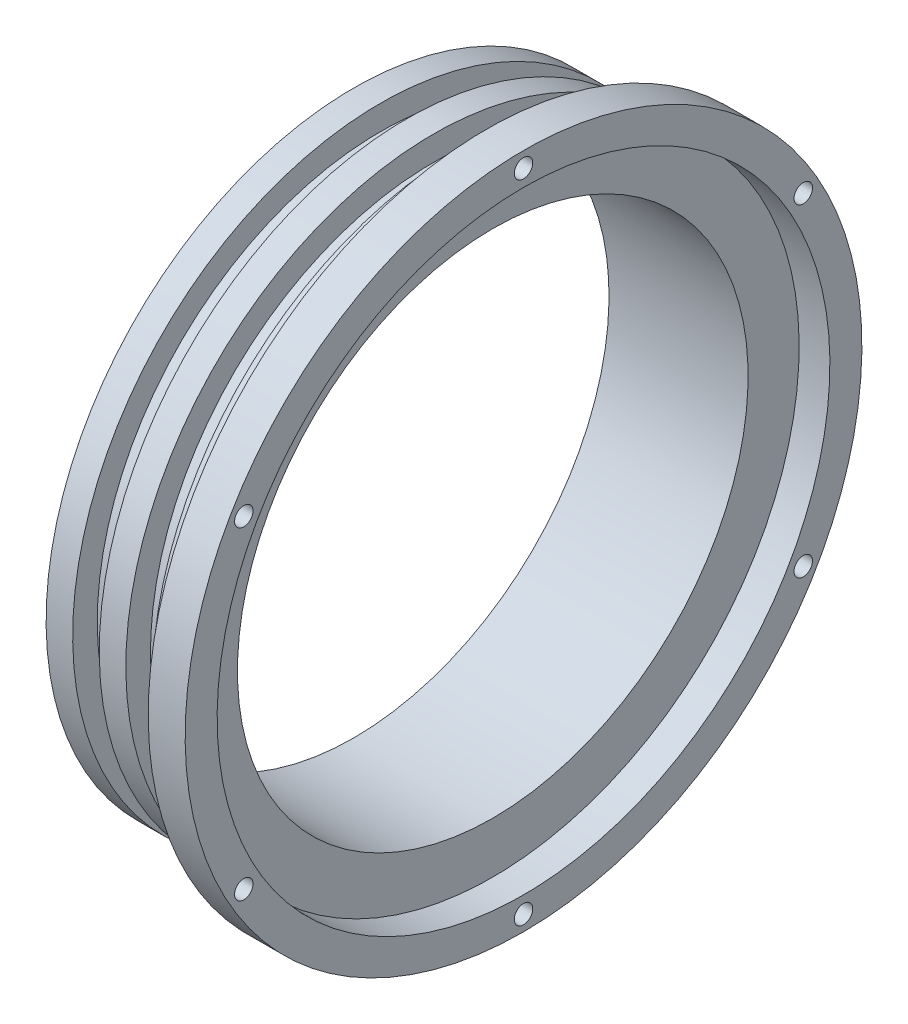
ISO-10303-21;
HEADER;
FILE_DESCRIPTION(('STEP AP214'),'2;1');
FILE_NAME('part.step','',(''),(''),'','','');
FILE_SCHEMA(('AUTOMOTIVE_DESIGN { 1 0 10303 214 1 1 1 1 }'));
ENDSEC;
DATA;
#1=APPLICATION_CONTEXT('core data for automotive mechanical design processes');
#2=APPLICATION_PROTOCOL_DEFINITION('international standard','automotive_design',2000,#1);
#3=PRODUCT_CONTEXT('',#1,'mechanical');
#4=PRODUCT('Part','Part','',(#3));
#5=PRODUCT_RELATED_PRODUCT_CATEGORY('part','',(#4));
#6=PRODUCT_DEFINITION_FORMATION('','',#4);
#7=PRODUCT_DEFINITION_CONTEXT('part definition',#1,'design');
#8=PRODUCT_DEFINITION('design','',#6,#7);
#9=PRODUCT_DEFINITION_SHAPE('','',#8);
#10=(LENGTH_UNIT() NAMED_UNIT(*) SI_UNIT(.MILLI.,.METRE.));
#11=(NAMED_UNIT(*) PLANE_ANGLE_UNIT() SI_UNIT($,.RADIAN.));
#12=(NAMED_UNIT(*) SI_UNIT($,.STERADIAN.) SOLID_ANGLE_UNIT());
#13=UNCERTAINTY_MEASURE_WITH_UNIT(LENGTH_MEASURE(1.E-05),#10,'distance_accuracy_value','');
#14=(GEOMETRIC_REPRESENTATION_CONTEXT(3) GLOBAL_UNCERTAINTY_ASSIGNED_CONTEXT((#13)) GLOBAL_UNIT_ASSIGNED_CONTEXT((#10,
#11,#12)) REPRESENTATION_CONTEXT('',''));
#15=CARTESIAN_POINT('',(0.,0.,0.));
#16=DIRECTION('',(0.,0.,1.));
#17=DIRECTION('',(1.,0.,0.));
#18=AXIS2_PLACEMENT_3D('',#15,#16,#17);
#19=CARTESIAN_POINT('',(27.6,0.,0.));
#20=DIRECTION('',(-1.,0.,0.));
#21=DIRECTION('',(0.,-1.,0.));
#22=AXIS2_PLACEMENT_3D('',#19,#20,#21);
#23=CYLINDRICAL_SURFACE('',#22,41.5);
#24=CARTESIAN_POINT('',(0.,0.,0.));
#25=DIRECTION('',(-1.,0.,0.));
#26=DIRECTION('',(0.,-1.,0.));
#27=AXIS2_PLACEMENT_3D('',#24,#25,#26);
#28=CIRCLE('',#27,41.5);
#29=CARTESIAN_POINT('',(0.,-41.5,0.));
#30=VERTEX_POINT('',#29);
#31=EDGE_CURVE('E10',#30,#30,#28,.T.);
#32=ORIENTED_EDGE('',*,*,#31,.T.);
#33=EDGE_LOOP('',(#32));
#34=FACE_BOUND('',#33,.T.);
#35=CARTESIAN_POINT('',(22.6,0.,0.));
#36=DIRECTION('',(1.,0.,0.));
#37=DIRECTION('',(0.,1.,0.));
#38=AXIS2_PLACEMENT_3D('',#35,#36,#37);
#39=CIRCLE('',#38,41.5);
#40=CARTESIAN_POINT('',(22.6,41.5,0.));
#41=VERTEX_POINT('',#40);
#42=EDGE_CURVE('E36',#41,#41,#39,.F.);
#43=ORIENTED_EDGE('',*,*,#42,.F.);
#44=EDGE_LOOP('',(#43));
#45=FACE_BOUND('',#44,.T.);
#46=ADVANCED_FACE('F33',(#34,#45),#23,.F.);
#47=CARTESIAN_POINT('',(0.,41.5,0.));
#48=DIRECTION('',(1.,0.,0.));
#49=DIRECTION('',(0.,1.,0.));
#50=AXIS2_PLACEMENT_3D('',#47,#48,#49);
#51=PLANE('',#50);
#52=CARTESIAN_POINT('',(0.,22.0000000000004,-38.105117766515));
#53=DIRECTION('',(-1.,0.,0.));
#54=DIRECTION('',(0.,-0.50000000000001,0.866025403784433));
#55=AXIS2_PLACEMENT_3D('',#52,#53,#54);
#56=CIRCLE('',#55,1.5);
#57=CARTESIAN_POINT('',(0.,21.2500000000004,-36.8060796608384));
#58=VERTEX_POINT('',#57);
#59=EDGE_CURVE('E92',#58,#58,#56,.T.);
#60=ORIENTED_EDGE('',*,*,#59,.F.);
#61=EDGE_LOOP('',(#60));
#62=FACE_BOUND('',#61,.T.);
#63=CARTESIAN_POINT('',(0.,-21.9999999999996,-38.1051177665155));
#64=DIRECTION('',(-1.,0.,0.));
#65=DIRECTION('',(0.,0.499999999999992,0.866025403784443));
#66=AXIS2_PLACEMENT_3D('',#63,#64,#65);
#67=CIRCLE('',#66,1.5);
#68=CARTESIAN_POINT('',(0.,-21.2499999999997,-36.8060796608388));
#69=VERTEX_POINT('',#68);
#70=EDGE_CURVE('E99',#69,#69,#67,.T.);
#71=ORIENTED_EDGE('',*,*,#70,.F.);
#72=EDGE_LOOP('',(#71));
#73=FACE_BOUND('',#72,.T.);
#74=CARTESIAN_POINT('',(0.,-44.,0.));
#75=DIRECTION('',(-1.,0.,0.));
#76=DIRECTION('',(0.,1.,0.));
#77=AXIS2_PLACEMENT_3D('',#74,#75,#76);
#78=CIRCLE('',#77,1.5);
#79=CARTESIAN_POINT('',(0.,-42.5,0.));
#80=VERTEX_POINT('',#79);
#81=EDGE_CURVE('E105',#80,#80,#78,.T.);
#82=ORIENTED_EDGE('',*,*,#81,.F.);
#83=EDGE_LOOP('',(#82));
#84=FACE_BOUND('',#83,.T.);
#85=CARTESIAN_POINT('',(0.,-22.0000000000002,38.1051177665152));
#86=DIRECTION('',(-1.,0.,0.));
#87=DIRECTION('',(0.,0.500000000000004,-0.866025403784436));
#88=AXIS2_PLACEMENT_3D('',#85,#86,#87);
#89=CIRCLE('',#88,1.5);
#90=CARTESIAN_POINT('',(0.,-21.2500000000002,36.8060796608385));
#91=VERTEX_POINT('',#90);
#92=EDGE_CURVE('E111',#91,#91,#89,.T.);
#93=ORIENTED_EDGE('',*,*,#92,.F.);
#94=EDGE_LOOP('',(#93));
#95=FACE_BOUND('',#94,.T.);
#96=CARTESIAN_POINT('',(0.,21.9999999999999,38.1051177665153));
#97=DIRECTION('',(-1.,0.,0.));
#98=DIRECTION('',(0.,-0.499999999999998,-0.86602540378444));
#99=AXIS2_PLACEMENT_3D('',#96,#97,#98);
#100=CIRCLE('',#99,1.5);
#101=CARTESIAN_POINT('',(0.,21.2499999999999,36.8060796608387));
#102=VERTEX_POINT('',#101);
#103=EDGE_CURVE('E86',#102,#102,#100,.T.);
#104=ORIENTED_EDGE('',*,*,#103,.F.);
#105=EDGE_LOOP('',(#104));
#106=FACE_BOUND('',#105,.T.);
#107=CARTESIAN_POINT('',(0.,44.,0.));
#108=DIRECTION('',(-1.,0.,0.));
#109=DIRECTION('',(0.,-1.,0.));
#110=AXIS2_PLACEMENT_3D('',#107,#108,#109);
#111=CIRCLE('',#110,1.5);
#112=CARTESIAN_POINT('',(0.,42.5,0.));
#113=VERTEX_POINT('',#112);
#114=EDGE_CURVE('E80',#113,#113,#111,.T.);
#115=ORIENTED_EDGE('',*,*,#114,.F.);
#116=EDGE_LOOP('',(#115));
#117=FACE_BOUND('',#116,.T.);
#118=ORIENTED_EDGE('',*,*,#31,.F.);
#119=EDGE_LOOP('',(#118));
#120=FACE_BOUND('',#119,.T.);
#121=CARTESIAN_POINT('',(0.,0.,0.));
#122=DIRECTION('',(-1.,0.,0.));
#123=DIRECTION('',(0.,-1.,0.));
#124=AXIS2_PLACEMENT_3D('',#121,#122,#123);
#125=CIRCLE('',#124,50.);
#126=CARTESIAN_POINT('',(0.,-50.,0.));
#127=VERTEX_POINT('',#126);
#128=EDGE_CURVE('E40',#127,#127,#125,.T.);
#129=ORIENTED_EDGE('',*,*,#128,.T.);
#130=EDGE_LOOP('',(#129));
#131=FACE_BOUND('',#130,.T.);
#132=ADVANCED_FACE('F164',(#62,#73,#84,#95,#106,#117,#120,#131),#51,.F.);
#133=CARTESIAN_POINT('',(27.6,0.,0.));
#134=DIRECTION('',(-1.,0.,0.));
#135=DIRECTION('',(0.,-1.,0.));
#136=AXIS2_PLACEMENT_3D('',#133,#134,#135);
#137=CYLINDRICAL_SURFACE('',#136,50.);
#138=ORIENTED_EDGE('',*,*,#128,.F.);
#139=EDGE_LOOP('',(#138));
#140=FACE_BOUND('',#139,.T.);
#141=CARTESIAN_POINT('',(4.32,0.,0.));
#142=DIRECTION('',(-1.,0.,0.));
#143=DIRECTION('',(0.,-1.,0.));
#144=AXIS2_PLACEMENT_3D('',#141,#142,#143);
#145=CIRCLE('',#144,50.);
#146=CARTESIAN_POINT('',(4.32,-50.,0.));
#147=VERTEX_POINT('',#146);
#148=EDGE_CURVE('E44',#147,#147,#145,.T.);
#149=ORIENTED_EDGE('',*,*,#148,.T.);
#150=EDGE_LOOP('',(#149));
#151=FACE_BOUND('',#150,.T.);
#152=ADVANCED_FACE('F168',(#140,#151),#137,.T.);
#153=CARTESIAN_POINT('',(4.32,50.,0.));
#154=DIRECTION('',(-1.,0.,0.));
#155=DIRECTION('',(0.,-1.,0.));
#156=AXIS2_PLACEMENT_3D('',#153,#154,#155);
#157=PLANE('',#156);
#158=ORIENTED_EDGE('',*,*,#148,.F.);
#159=EDGE_LOOP('',(#158));
#160=FACE_BOUND('',#159,.T.);
#161=CARTESIAN_POINT('',(4.32,0.,0.));
#162=DIRECTION('',(-1.,0.,0.));
#163=DIRECTION('',(0.,-1.,0.));
#164=AXIS2_PLACEMENT_3D('',#161,#162,#163);
#165=CIRCLE('',#164,46.);
#166=CARTESIAN_POINT('',(4.32,-46.,0.));
#167=VERTEX_POINT('',#166);
#168=EDGE_CURVE('E49',#167,#167,#165,.T.);
#169=ORIENTED_EDGE('',*,*,#168,.T.);
#170=EDGE_LOOP('',(#169));
#171=FACE_BOUND('',#170,.T.);
#172=ADVANCED_FACE('F173',(#160,#171),#157,.F.);
#173=CARTESIAN_POINT('',(27.6,0.,0.));
#174=DIRECTION('',(-1.,0.,0.));
#175=DIRECTION('',(0.,-1.,0.));
#176=AXIS2_PLACEMENT_3D('',#173,#174,#175);
#177=CYLINDRICAL_SURFACE('',#176,46.);
#178=ORIENTED_EDGE('',*,*,#168,.F.);
#179=EDGE_LOOP('',(#178));
#180=FACE_BOUND('',#179,.T.);
#181=CARTESIAN_POINT('',(8.64,0.,0.));
#182=DIRECTION('',(-1.,0.,0.));
#183=DIRECTION('',(0.,-1.,0.));
#184=AXIS2_PLACEMENT_3D('',#181,#182,#183);
#185=CIRCLE('',#184,46.);
#186=CARTESIAN_POINT('',(8.64,-46.,0.));
#187=VERTEX_POINT('',#186);
#188=EDGE_CURVE('E52',#187,#187,#185,.T.);
#189=ORIENTED_EDGE('',*,*,#188,.T.);
#190=EDGE_LOOP('',(#189));
#191=FACE_BOUND('',#190,.T.);
#192=ADVANCED_FACE('F181',(#180,#191),#177,.T.);
#193=CARTESIAN_POINT('',(8.64,46.,0.));
#194=DIRECTION('',(1.,0.,0.));
#195=DIRECTION('',(0.,1.,0.));
#196=AXIS2_PLACEMENT_3D('',#193,#194,#195);
#197=PLANE('',#196);
#198=ORIENTED_EDGE('',*,*,#188,.F.);
#199=EDGE_LOOP('',(#198));
#200=FACE_BOUND('',#199,.T.);
#201=CARTESIAN_POINT('',(8.64,0.,0.));
#202=DIRECTION('',(-1.,0.,0.));
#203=DIRECTION('',(0.,-1.,0.));
#204=AXIS2_PLACEMENT_3D('',#201,#202,#203);
#205=CIRCLE('',#204,50.);
#206=CARTESIAN_POINT('',(8.64,-50.,0.));
#207=VERTEX_POINT('',#206);
#208=EDGE_CURVE('E55',#207,#207,#205,.T.);
#209=ORIENTED_EDGE('',*,*,#208,.T.);
#210=EDGE_LOOP('',(#209));
#211=FACE_BOUND('',#210,.T.);
#212=ADVANCED_FACE('F185',(#200,#211),#197,.F.);
#213=CARTESIAN_POINT('',(27.6,0.,0.));
#214=DIRECTION('',(-1.,0.,0.));
#215=DIRECTION('',(0.,-1.,0.));
#216=AXIS2_PLACEMENT_3D('',#213,#214,#215);
#217=CYLINDRICAL_SURFACE('',#216,50.);
#218=ORIENTED_EDGE('',*,*,#208,.F.);
#219=EDGE_LOOP('',(#218));
#220=FACE_BOUND('',#219,.T.);
#221=CARTESIAN_POINT('',(12.96,0.,0.));
#222=DIRECTION('',(-1.,0.,0.));
#223=DIRECTION('',(0.,-1.,0.));
#224=AXIS2_PLACEMENT_3D('',#221,#222,#223);
#225=CIRCLE('',#224,50.);
#226=CARTESIAN_POINT('',(12.96,-50.,0.));
#227=VERTEX_POINT('',#226);
#228=EDGE_CURVE('E58',#227,#227,#225,.T.);
#229=ORIENTED_EDGE('',*,*,#228,.T.);
#230=EDGE_LOOP('',(#229));
#231=FACE_BOUND('',#230,.T.);
#232=ADVANCED_FACE('F189',(#220,#231),#217,.T.);
#233=CARTESIAN_POINT('',(12.96,50.,0.));
#234=DIRECTION('',(-1.,0.,0.));
#235=DIRECTION('',(0.,-1.,0.));
#236=AXIS2_PLACEMENT_3D('',#233,#234,#235);
#237=PLANE('',#236);
#238=ORIENTED_EDGE('',*,*,#228,.F.);
#239=EDGE_LOOP('',(#238));
#240=FACE_BOUND('',#239,.T.);
#241=CARTESIAN_POINT('',(12.96,0.,0.));
#242=DIRECTION('',(-1.,0.,0.));
#243=DIRECTION('',(0.,-1.,0.));
#244=AXIS2_PLACEMENT_3D('',#241,#242,#243);
#245=CIRCLE('',#244,46.);
#246=CARTESIAN_POINT('',(12.96,-46.,0.));
#247=VERTEX_POINT('',#246);
#248=EDGE_CURVE('E61',#247,#247,#245,.T.);
#249=ORIENTED_EDGE('',*,*,#248,.T.);
#250=EDGE_LOOP('',(#249));
#251=FACE_BOUND('',#250,.T.);
#252=ADVANCED_FACE('F193',(#240,#251),#237,.F.);
#253=CARTESIAN_POINT('',(27.6,0.,0.));
#254=DIRECTION('',(-1.,0.,0.));
#255=DIRECTION('',(0.,-1.,0.));
#256=AXIS2_PLACEMENT_3D('',#253,#254,#255);
#257=CYLINDRICAL_SURFACE('',#256,46.);
#258=ORIENTED_EDGE('',*,*,#248,.F.);
#259=EDGE_LOOP('',(#258));
#260=FACE_BOUND('',#259,.T.);
#261=CARTESIAN_POINT('',(17.28,0.,0.));
#262=DIRECTION('',(-1.,0.,0.));
#263=DIRECTION('',(0.,-1.,0.));
#264=AXIS2_PLACEMENT_3D('',#261,#262,#263);
#265=CIRCLE('',#264,46.);
#266=CARTESIAN_POINT('',(17.28,-46.,0.));
#267=VERTEX_POINT('',#266);
#268=EDGE_CURVE('E64',#267,#267,#265,.T.);
#269=ORIENTED_EDGE('',*,*,#268,.T.);
#270=EDGE_LOOP('',(#269));
#271=FACE_BOUND('',#270,.T.);
#272=ADVANCED_FACE('F197',(#260,#271),#257,.T.);
#273=CARTESIAN_POINT('',(17.28,46.,0.));
#274=DIRECTION('',(1.,0.,0.));
#275=DIRECTION('',(0.,1.,0.));
#276=AXIS2_PLACEMENT_3D('',#273,#274,#275);
#277=PLANE('',#276);
#278=ORIENTED_EDGE('',*,*,#268,.F.);
#279=EDGE_LOOP('',(#278));
#280=FACE_BOUND('',#279,.T.);
#281=CARTESIAN_POINT('',(17.28,0.,0.));
#282=DIRECTION('',(-1.,0.,0.));
#283=DIRECTION('',(0.,-1.,0.));
#284=AXIS2_PLACEMENT_3D('',#281,#282,#283);
#285=CIRCLE('',#284,50.);
#286=CARTESIAN_POINT('',(17.28,-50.,0.));
#287=VERTEX_POINT('',#286);
#288=EDGE_CURVE('E67',#287,#287,#285,.T.);
#289=ORIENTED_EDGE('',*,*,#288,.T.);
#290=EDGE_LOOP('',(#289));
#291=FACE_BOUND('',#290,.T.);
#292=ADVANCED_FACE('F201',(#280,#291),#277,.F.);
#293=CARTESIAN_POINT('',(27.6,0.,0.));
#294=DIRECTION('',(-1.,0.,0.));
#295=DIRECTION('',(0.,-1.,0.));
#296=AXIS2_PLACEMENT_3D('',#293,#294,#295);
#297=CYLINDRICAL_SURFACE('',#296,50.);
#298=ORIENTED_EDGE('',*,*,#288,.F.);
#299=EDGE_LOOP('',(#298));
#300=FACE_BOUND('',#299,.T.);
#301=CARTESIAN_POINT('',(21.6,0.,0.));
#302=DIRECTION('',(-1.,0.,0.));
#303=DIRECTION('',(0.,-1.,0.));
#304=AXIS2_PLACEMENT_3D('',#301,#302,#303);
#305=CIRCLE('',#304,50.);
#306=CARTESIAN_POINT('',(21.6,-50.,0.));
#307=VERTEX_POINT('',#306);
#308=EDGE_CURVE('E70',#307,#307,#305,.T.);
#309=ORIENTED_EDGE('',*,*,#308,.T.);
#310=EDGE_LOOP('',(#309));
#311=FACE_BOUND('',#310,.T.);
#312=ADVANCED_FACE('F205',(#300,#311),#297,.T.);
#313=CARTESIAN_POINT('',(21.6,50.,0.));
#314=DIRECTION('',(1.,0.,0.));
#315=DIRECTION('',(0.,1.,0.));
#316=AXIS2_PLACEMENT_3D('',#313,#314,#315);
#317=PLANE('',#316);
#318=CARTESIAN_POINT('',(21.6,26.2500000000005,45.4663336986827));
#319=DIRECTION('',(1.,0.,0.));
#320=DIRECTION('',(0.,1.,0.));
#321=AXIS2_PLACEMENT_3D('',#318,#319,#320);
#322=CIRCLE('',#321,1.5);
#323=CARTESIAN_POINT('',(21.6,27.7500000000005,45.4663336986827));
#324=VERTEX_POINT('',#323);
#325=EDGE_CURVE('E121',#324,#324,#322,.T.);
#326=ORIENTED_EDGE('',*,*,#325,.T.);
#327=EDGE_LOOP('',(#326));
#328=FACE_BOUND('',#327,.T.);
#329=CARTESIAN_POINT('',(21.6,-26.2499999999996,45.4663336986833));
#330=DIRECTION('',(1.,0.,0.));
#331=DIRECTION('',(0.,1.,0.));
#332=AXIS2_PLACEMENT_3D('',#329,#330,#331);
#333=CIRCLE('',#332,1.5);
#334=CARTESIAN_POINT('',(21.6,-24.7499999999996,45.4663336986833));
#335=VERTEX_POINT('',#334);
#336=EDGE_CURVE('E124',#335,#335,#333,.T.);
#337=ORIENTED_EDGE('',*,*,#336,.T.);
#338=EDGE_LOOP('',(#337));
#339=FACE_BOUND('',#338,.T.);
#340=CARTESIAN_POINT('',(21.6,-52.5,0.));
#341=DIRECTION('',(1.,0.,0.));
#342=DIRECTION('',(0.,1.,0.));
#343=AXIS2_PLACEMENT_3D('',#340,#341,#342);
#344=CIRCLE('',#343,1.5);
#345=CARTESIAN_POINT('',(21.6,-51.,0.));
#346=VERTEX_POINT('',#345);
#347=EDGE_CURVE('E127',#346,#346,#344,.T.);
#348=ORIENTED_EDGE('',*,*,#347,.T.);
#349=EDGE_LOOP('',(#348));
#350=FACE_BOUND('',#349,.T.);
#351=CARTESIAN_POINT('',(21.6,-26.2500000000002,-45.4663336986829));
#352=DIRECTION('',(1.,0.,0.));
#353=DIRECTION('',(0.,1.,0.));
#354=AXIS2_PLACEMENT_3D('',#351,#352,#353);
#355=CIRCLE('',#354,1.5);
#356=CARTESIAN_POINT('',(21.6,-24.7500000000002,-45.4663336986829));
#357=VERTEX_POINT('',#356);
#358=EDGE_CURVE('E130',#357,#357,#355,.T.);
#359=ORIENTED_EDGE('',*,*,#358,.T.);
#360=EDGE_LOOP('',(#359));
#361=FACE_BOUND('',#360,.T.);
#362=CARTESIAN_POINT('',(21.6,26.2499999999999,-45.4663336986831));
#363=DIRECTION('',(1.,0.,0.));
#364=DIRECTION('',(0.,1.,0.));
#365=AXIS2_PLACEMENT_3D('',#362,#363,#364);
#366=CIRCLE('',#365,1.5);
#367=CARTESIAN_POINT('',(21.6,27.7499999999999,-45.4663336986831));
#368=VERTEX_POINT('',#367);
#369=EDGE_CURVE('E133',#368,#368,#366,.T.);
#370=ORIENTED_EDGE('',*,*,#369,.T.);
#371=EDGE_LOOP('',(#370));
#372=FACE_BOUND('',#371,.T.);
#373=CARTESIAN_POINT('',(21.6,52.5,0.));
#374=DIRECTION('',(1.,0.,0.));
#375=DIRECTION('',(0.,1.,0.));
#376=AXIS2_PLACEMENT_3D('',#373,#374,#375);
#377=CIRCLE('',#376,1.5);
#378=CARTESIAN_POINT('',(21.6,54.,0.));
#379=VERTEX_POINT('',#378);
#380=EDGE_CURVE('E96',#379,#379,#377,.T.);
#381=ORIENTED_EDGE('',*,*,#380,.T.);
#382=EDGE_LOOP('',(#381));
#383=FACE_BOUND('',#382,.T.);
#384=ORIENTED_EDGE('',*,*,#308,.F.);
#385=EDGE_LOOP('',(#384));
#386=FACE_BOUND('',#385,.T.);
#387=CARTESIAN_POINT('',(21.6,0.,0.));
#388=DIRECTION('',(-1.,0.,0.));
#389=DIRECTION('',(0.,-1.,0.));
#390=AXIS2_PLACEMENT_3D('',#387,#388,#389);
#391=CIRCLE('',#390,55.);
#392=CARTESIAN_POINT('',(21.6,-55.,0.));
#393=VERTEX_POINT('',#392);
#394=EDGE_CURVE('E73',#393,#393,#391,.T.);
#395=ORIENTED_EDGE('',*,*,#394,.T.);
#396=EDGE_LOOP('',(#395));
#397=FACE_BOUND('',#396,.T.);
#398=ADVANCED_FACE('F209',(#328,#339,#350,#361,#372,#383,#386,#397),#317,.F.);
#399=CARTESIAN_POINT('',(27.6,0.,0.));
#400=DIRECTION('',(-1.,0.,0.));
#401=DIRECTION('',(0.,-1.,0.));
#402=AXIS2_PLACEMENT_3D('',#399,#400,#401);
#403=CYLINDRICAL_SURFACE('',#402,55.);
#404=ORIENTED_EDGE('',*,*,#394,.F.);
#405=EDGE_LOOP('',(#404));
#406=FACE_BOUND('',#405,.T.);
#407=CARTESIAN_POINT('',(27.6,0.,0.));
#408=DIRECTION('',(-1.,0.,0.));
#409=DIRECTION('',(0.,-1.,0.));
#410=AXIS2_PLACEMENT_3D('',#407,#408,#409);
#411=CIRCLE('',#410,55.);
#412=CARTESIAN_POINT('',(27.6,-55.,0.));
#413=VERTEX_POINT('',#412);
#414=EDGE_CURVE('E76',#413,#413,#411,.T.);
#415=ORIENTED_EDGE('',*,*,#414,.T.);
#416=EDGE_LOOP('',(#415));
#417=FACE_BOUND('',#416,.T.);
#418=ADVANCED_FACE('F213',(#406,#417),#403,.T.);
#419=CARTESIAN_POINT('',(27.6,55.,0.));
#420=DIRECTION('',(-1.,0.,0.));
#421=DIRECTION('',(0.,-1.,0.));
#422=AXIS2_PLACEMENT_3D('',#419,#420,#421);
#423=PLANE('',#422);
#424=CARTESIAN_POINT('',(27.6,0.,0.));
#425=DIRECTION('',(1.,0.,0.));
#426=DIRECTION('',(0.,1.,0.));
#427=AXIS2_PLACEMENT_3D('',#424,#425,#426);
#428=CIRCLE('',#427,49.8);
#429=CARTESIAN_POINT('',(27.6,49.8,0.));
#430=VERTEX_POINT('',#429);
#431=EDGE_CURVE('E151',#430,#430,#428,.T.);
#432=ORIENTED_EDGE('',*,*,#431,.F.);
#433=EDGE_LOOP('',(#432));
#434=FACE_BOUND('',#433,.T.);
#435=CARTESIAN_POINT('',(27.6,26.2500000000005,45.4663336986827));
#436=DIRECTION('',(-1.,0.,0.));
#437=DIRECTION('',(0.,-0.866025403784433,0.50000000000001));
#438=AXIS2_PLACEMENT_3D('',#435,#436,#437);
#439=CIRCLE('',#438,1.5);
#440=CARTESIAN_POINT('',(27.6,24.9509618943239,46.2163336986827));
#441=VERTEX_POINT('',#440);
#442=EDGE_CURVE('E140',#441,#441,#439,.T.);
#443=ORIENTED_EDGE('',*,*,#442,.T.);
#444=EDGE_LOOP('',(#443));
#445=FACE_BOUND('',#444,.T.);
#446=CARTESIAN_POINT('',(27.6,-26.2499999999996,45.4663336986833));
#447=DIRECTION('',(-1.,0.,0.));
#448=DIRECTION('',(0.,-0.866025403784443,-0.499999999999992));
#449=AXIS2_PLACEMENT_3D('',#446,#447,#448);
#450=CIRCLE('',#449,1.5);
#451=CARTESIAN_POINT('',(27.6,-27.5490381056762,44.7163336986833));
#452=VERTEX_POINT('',#451);
#453=EDGE_CURVE('E143',#452,#452,#450,.T.);
#454=ORIENTED_EDGE('',*,*,#453,.T.);
#455=EDGE_LOOP('',(#454));
#456=FACE_BOUND('',#455,.T.);
#457=CARTESIAN_POINT('',(27.6,-52.5,0.));
#458=DIRECTION('',(-1.,0.,0.));
#459=DIRECTION('',(0.,0.,-1.));
#460=AXIS2_PLACEMENT_3D('',#457,#458,#459);
#461=CIRCLE('',#460,1.5);
#462=CARTESIAN_POINT('',(27.6,-52.5,-1.5));
#463=VERTEX_POINT('',#462);
#464=EDGE_CURVE('E146',#463,#463,#461,.T.);
#465=ORIENTED_EDGE('',*,*,#464,.T.);
#466=EDGE_LOOP('',(#465));
#467=FACE_BOUND('',#466,.T.);
#468=CARTESIAN_POINT('',(27.6,-26.2500000000002,-45.4663336986829));
#469=DIRECTION('',(-1.,0.,0.));
#470=DIRECTION('',(0.,0.866025403784436,-0.500000000000004));
#471=AXIS2_PLACEMENT_3D('',#468,#469,#470);
#472=CIRCLE('',#471,1.5);
#473=CARTESIAN_POINT('',(27.6,-24.9509618943236,-46.2163336986829));
#474=VERTEX_POINT('',#473);
#475=EDGE_CURVE('E139',#474,#474,#472,.T.);
#476=ORIENTED_EDGE('',*,*,#475,.T.);
#477=EDGE_LOOP('',(#476));
#478=FACE_BOUND('',#477,.T.);
#479=CARTESIAN_POINT('',(27.6,26.2499999999999,-45.4663336986831));
#480=DIRECTION('',(-1.,0.,0.));
#481=DIRECTION('',(0.,0.86602540378444,0.499999999999998));
#482=AXIS2_PLACEMENT_3D('',#479,#480,#481);
#483=CIRCLE('',#482,1.5);
#484=CARTESIAN_POINT('',(27.6,27.5490381056766,-44.7163336986831));
#485=VERTEX_POINT('',#484);
#486=EDGE_CURVE('E136',#485,#485,#483,.T.);
#487=ORIENTED_EDGE('',*,*,#486,.T.);
#488=EDGE_LOOP('',(#487));
#489=FACE_BOUND('',#488,.T.);
#490=CARTESIAN_POINT('',(27.6,52.5,0.));
#491=DIRECTION('',(-1.,0.,0.));
#492=DIRECTION('',(0.,0.,1.));
#493=AXIS2_PLACEMENT_3D('',#490,#491,#492);
#494=CIRCLE('',#493,1.5);
#495=CARTESIAN_POINT('',(27.6,52.5,1.5));
#496=VERTEX_POINT('',#495);
#497=EDGE_CURVE('E118',#496,#496,#494,.T.);
#498=ORIENTED_EDGE('',*,*,#497,.T.);
#499=EDGE_LOOP('',(#498));
#500=FACE_BOUND('',#499,.T.);
#501=ORIENTED_EDGE('',*,*,#414,.F.);
#502=EDGE_LOOP('',(#501));
#503=FACE_BOUND('',#502,.T.);
#504=ADVANCED_FACE('F217',(#434,#445,#456,#467,#478,#489,#500,#503),#423,.F.);
#505=CARTESIAN_POINT('',(6.,44.,0.));
#506=DIRECTION('',(-1.,0.,0.));
#507=DIRECTION('',(0.,-1.,0.));
#508=AXIS2_PLACEMENT_3D('',#505,#506,#507);
#509=CYLINDRICAL_SURFACE('',#508,1.5);
#510=CARTESIAN_POINT('',(6.,44.,0.));
#511=DIRECTION('',(-1.,0.,0.));
#512=DIRECTION('',(0.,-1.,0.));
#513=AXIS2_PLACEMENT_3D('',#510,#511,#512);
#514=CIRCLE('',#513,1.5);
#515=CARTESIAN_POINT('',(6.,42.5,0.));
#516=VERTEX_POINT('',#515);
#517=EDGE_CURVE('E79',#516,#516,#514,.T.);
#518=ORIENTED_EDGE('',*,*,#517,.F.);
#519=EDGE_LOOP('',(#518));
#520=FACE_BOUND('',#519,.T.);
#521=ORIENTED_EDGE('',*,*,#114,.T.);
#522=EDGE_LOOP('',(#521));
#523=FACE_BOUND('',#522,.T.);
#524=ADVANCED_FACE('F221',(#520,#523),#509,.F.);
#525=CARTESIAN_POINT('',(6.,0.,0.));
#526=DIRECTION('',(-1.,0.,0.));
#527=DIRECTION('',(0.,-1.,0.));
#528=AXIS2_PLACEMENT_3D('',#525,#526,#527);
#529=PLANE('',#528);
#530=ORIENTED_EDGE('',*,*,#517,.T.);
#531=EDGE_LOOP('',(#530));
#532=FACE_BOUND('',#531,.T.);
#533=ADVANCED_FACE('F225',(#532),#529,.T.);
#534=CARTESIAN_POINT('',(6.,21.9999999999999,38.1051177665153));
#535=DIRECTION('',(-1.,0.,0.));
#536=DIRECTION('',(0.,-1.,0.));
#537=AXIS2_PLACEMENT_3D('',#534,#535,#536);
#538=CYLINDRICAL_SURFACE('',#537,1.5);
#539=CARTESIAN_POINT('',(6.,21.9999999999999,38.1051177665153));
#540=DIRECTION('',(-1.,0.,0.));
#541=DIRECTION('',(0.,-0.499999999999998,-0.86602540378444));
#542=AXIS2_PLACEMENT_3D('',#539,#540,#541);
#543=CIRCLE('',#542,1.5);
#544=CARTESIAN_POINT('',(6.,21.2499999999999,36.8060796608387));
#545=VERTEX_POINT('',#544);
#546=EDGE_CURVE('E83',#545,#545,#543,.T.);
#547=ORIENTED_EDGE('',*,*,#546,.F.);
#548=EDGE_LOOP('',(#547));
#549=FACE_BOUND('',#548,.T.);
#550=ORIENTED_EDGE('',*,*,#103,.T.);
#551=EDGE_LOOP('',(#550));
#552=FACE_BOUND('',#551,.T.);
#553=ADVANCED_FACE('F229',(#549,#552),#538,.F.);
#554=CARTESIAN_POINT('',(6.,0.,0.));
#555=DIRECTION('',(-1.,0.,0.));
#556=DIRECTION('',(0.,-0.499999999999998,-0.86602540378444));
#557=AXIS2_PLACEMENT_3D('',#554,#555,#556);
#558=PLANE('',#557);
#559=ORIENTED_EDGE('',*,*,#546,.T.);
#560=EDGE_LOOP('',(#559));
#561=FACE_BOUND('',#560,.T.);
#562=ADVANCED_FACE('F233',(#561),#558,.T.);
#563=CARTESIAN_POINT('',(6.,-22.0000000000002,38.1051177665152));
#564=DIRECTION('',(-1.,0.,0.));
#565=DIRECTION('',(0.,-1.,0.));
#566=AXIS2_PLACEMENT_3D('',#563,#564,#565);
#567=CYLINDRICAL_SURFACE('',#566,1.5);
#568=CARTESIAN_POINT('',(6.,-22.0000000000002,38.1051177665152));
#569=DIRECTION('',(-1.,0.,0.));
#570=DIRECTION('',(0.,0.500000000000004,-0.866025403784436));
#571=AXIS2_PLACEMENT_3D('',#568,#569,#570);
#572=CIRCLE('',#571,1.5);
#573=CARTESIAN_POINT('',(6.,-21.2500000000002,36.8060796608385));
#574=VERTEX_POINT('',#573);
#575=EDGE_CURVE('E89',#574,#574,#572,.T.);
#576=ORIENTED_EDGE('',*,*,#575,.F.);
#577=EDGE_LOOP('',(#576));
#578=FACE_BOUND('',#577,.T.);
#579=ORIENTED_EDGE('',*,*,#92,.T.);
#580=EDGE_LOOP('',(#579));
#581=FACE_BOUND('',#580,.T.);
#582=ADVANCED_FACE('F237',(#578,#581),#567,.F.);
#583=CARTESIAN_POINT('',(6.,0.,0.));
#584=DIRECTION('',(-1.,0.,0.));
#585=DIRECTION('',(0.,0.500000000000004,-0.866025403784436));
#586=AXIS2_PLACEMENT_3D('',#583,#584,#585);
#587=PLANE('',#586);
#588=ORIENTED_EDGE('',*,*,#575,.T.);
#589=EDGE_LOOP('',(#588));
#590=FACE_BOUND('',#589,.T.);
#591=ADVANCED_FACE('F260',(#590),#587,.T.);
#592=CARTESIAN_POINT('',(6.,-44.,0.));
#593=DIRECTION('',(-1.,0.,0.));
#594=DIRECTION('',(0.,-1.,0.));
#595=AXIS2_PLACEMENT_3D('',#592,#593,#594);
#596=CYLINDRICAL_SURFACE('',#595,1.5);
#597=CARTESIAN_POINT('',(6.,-44.,0.));
#598=DIRECTION('',(-1.,0.,0.));
#599=DIRECTION('',(0.,1.,0.));
#600=AXIS2_PLACEMENT_3D('',#597,#598,#599);
#601=CIRCLE('',#600,1.5);
#602=CARTESIAN_POINT('',(6.,-42.5,0.));
#603=VERTEX_POINT('',#602);
#604=EDGE_CURVE('E108',#603,#603,#601,.T.);
#605=ORIENTED_EDGE('',*,*,#604,.F.);
#606=EDGE_LOOP('',(#605));
#607=FACE_BOUND('',#606,.T.);
#608=ORIENTED_EDGE('',*,*,#81,.T.);
#609=EDGE_LOOP('',(#608));
#610=FACE_BOUND('',#609,.T.);
#611=ADVANCED_FACE('F257',(#607,#610),#596,.F.);
#612=CARTESIAN_POINT('',(6.,0.,0.));
#613=DIRECTION('',(-1.,0.,0.));
#614=DIRECTION('',(0.,1.,0.));
#615=AXIS2_PLACEMENT_3D('',#612,#613,#614);
#616=PLANE('',#615);
#617=ORIENTED_EDGE('',*,*,#604,.T.);
#618=EDGE_LOOP('',(#617));
#619=FACE_BOUND('',#618,.T.);
#620=ADVANCED_FACE('F252',(#619),#616,.T.);
#621=CARTESIAN_POINT('',(6.,-21.9999999999996,-38.1051177665155));
#622=DIRECTION('',(-1.,0.,0.));
#623=DIRECTION('',(0.,-1.,0.));
#624=AXIS2_PLACEMENT_3D('',#621,#622,#623);
#625=CYLINDRICAL_SURFACE('',#624,1.5);
#626=CARTESIAN_POINT('',(6.,-21.9999999999996,-38.1051177665155));
#627=DIRECTION('',(-1.,0.,0.));
#628=DIRECTION('',(0.,0.499999999999992,0.866025403784443));
#629=AXIS2_PLACEMENT_3D('',#626,#627,#628);
#630=CIRCLE('',#629,1.5);
#631=CARTESIAN_POINT('',(6.,-21.2499999999997,-36.8060796608388));
#632=VERTEX_POINT('',#631);
#633=EDGE_CURVE('E102',#632,#632,#630,.T.);
#634=ORIENTED_EDGE('',*,*,#633,.F.);
#635=EDGE_LOOP('',(#634));
#636=FACE_BOUND('',#635,.T.);
#637=ORIENTED_EDGE('',*,*,#70,.T.);
#638=EDGE_LOOP('',(#637));
#639=FACE_BOUND('',#638,.T.);
#640=ADVANCED_FACE('F249',(#636,#639),#625,.F.);
#641=CARTESIAN_POINT('',(6.,0.,0.));
#642=DIRECTION('',(-1.,0.,0.));
#643=DIRECTION('',(0.,0.499999999999992,0.866025403784443));
#644=AXIS2_PLACEMENT_3D('',#641,#642,#643);
#645=PLANE('',#644);
#646=ORIENTED_EDGE('',*,*,#633,.T.);
#647=EDGE_LOOP('',(#646));
#648=FACE_BOUND('',#647,.T.);
#649=ADVANCED_FACE('F243',(#648),#645,.T.);
#650=CARTESIAN_POINT('',(6.,22.0000000000004,-38.105117766515));
#651=DIRECTION('',(-1.,0.,0.));
#652=DIRECTION('',(0.,-1.,0.));
#653=AXIS2_PLACEMENT_3D('',#650,#651,#652);
#654=CYLINDRICAL_SURFACE('',#653,1.5);
#655=CARTESIAN_POINT('',(6.,22.0000000000004,-38.105117766515));
#656=DIRECTION('',(-1.,0.,0.));
#657=DIRECTION('',(0.,-0.50000000000001,0.866025403784433));
#658=AXIS2_PLACEMENT_3D('',#655,#656,#657);
#659=CIRCLE('',#658,1.5);
#660=CARTESIAN_POINT('',(6.,21.2500000000004,-36.8060796608384));
#661=VERTEX_POINT('',#660);
#662=EDGE_CURVE('E95',#661,#661,#659,.T.);
#663=ORIENTED_EDGE('',*,*,#662,.F.);
#664=EDGE_LOOP('',(#663));
#665=FACE_BOUND('',#664,.T.);
#666=ORIENTED_EDGE('',*,*,#59,.T.);
#667=EDGE_LOOP('',(#666));
#668=FACE_BOUND('',#667,.T.);
#669=ADVANCED_FACE('F239',(#665,#668),#654,.F.);
#670=CARTESIAN_POINT('',(6.,0.,0.));
#671=DIRECTION('',(-1.,0.,0.));
#672=DIRECTION('',(0.,-0.50000000000001,0.866025403784433));
#673=AXIS2_PLACEMENT_3D('',#670,#671,#672);
#674=PLANE('',#673);
#675=ORIENTED_EDGE('',*,*,#662,.T.);
#676=EDGE_LOOP('',(#675));
#677=FACE_BOUND('',#676,.T.);
#678=ADVANCED_FACE('F242',(#677),#674,.T.);
#679=CARTESIAN_POINT('',(27.6,52.5,0.));
#680=DIRECTION('',(-1.,0.,0.));
#681=DIRECTION('',(0.,-1.,0.));
#682=AXIS2_PLACEMENT_3D('',#679,#680,#681);
#683=CYLINDRICAL_SURFACE('',#682,1.5);
#684=ORIENTED_EDGE('',*,*,#497,.F.);
#685=EDGE_LOOP('',(#684));
#686=FACE_BOUND('',#685,.T.);
#687=ORIENTED_EDGE('',*,*,#380,.F.);
#688=EDGE_LOOP('',(#687));
#689=FACE_BOUND('',#688,.T.);
#690=ADVANCED_FACE('F247',(#686,#689),#683,.F.);
#691=CARTESIAN_POINT('',(27.6,26.2499999999999,-45.4663336986831));
#692=DIRECTION('',(-1.,0.,0.));
#693=DIRECTION('',(0.,-1.,0.));
#694=AXIS2_PLACEMENT_3D('',#691,#692,#693);
#695=CYLINDRICAL_SURFACE('',#694,1.5);
#696=ORIENTED_EDGE('',*,*,#486,.F.);
#697=EDGE_LOOP('',(#696));
#698=FACE_BOUND('',#697,.T.);
#699=ORIENTED_EDGE('',*,*,#369,.F.);
#700=EDGE_LOOP('',(#699));
#701=FACE_BOUND('',#700,.T.);
#702=ADVANCED_FACE('F273',(#698,#701),#695,.F.);
#703=CARTESIAN_POINT('',(27.6,-26.2500000000002,-45.4663336986829));
#704=DIRECTION('',(-1.,0.,0.));
#705=DIRECTION('',(0.,-1.,0.));
#706=AXIS2_PLACEMENT_3D('',#703,#704,#705);
#707=CYLINDRICAL_SURFACE('',#706,1.5);
#708=ORIENTED_EDGE('',*,*,#475,.F.);
#709=EDGE_LOOP('',(#708));
#710=FACE_BOUND('',#709,.T.);
#711=ORIENTED_EDGE('',*,*,#358,.F.);
#712=EDGE_LOOP('',(#711));
#713=FACE_BOUND('',#712,.T.);
#714=ADVANCED_FACE('F277',(#710,#713),#707,.F.);
#715=CARTESIAN_POINT('',(27.6,-52.5,0.));
#716=DIRECTION('',(-1.,0.,0.));
#717=DIRECTION('',(0.,-1.,0.));
#718=AXIS2_PLACEMENT_3D('',#715,#716,#717);
#719=CYLINDRICAL_SURFACE('',#718,1.5);
#720=ORIENTED_EDGE('',*,*,#464,.F.);
#721=EDGE_LOOP('',(#720));
#722=FACE_BOUND('',#721,.T.);
#723=ORIENTED_EDGE('',*,*,#347,.F.);
#724=EDGE_LOOP('',(#723));
#725=FACE_BOUND('',#724,.T.);
#726=ADVANCED_FACE('F286',(#722,#725),#719,.F.);
#727=CARTESIAN_POINT('',(27.6,-26.2499999999996,45.4663336986833));
#728=DIRECTION('',(-1.,0.,0.));
#729=DIRECTION('',(0.,-1.,0.));
#730=AXIS2_PLACEMENT_3D('',#727,#728,#729);
#731=CYLINDRICAL_SURFACE('',#730,1.5);
#732=ORIENTED_EDGE('',*,*,#453,.F.);
#733=EDGE_LOOP('',(#732));
#734=FACE_BOUND('',#733,.T.);
#735=ORIENTED_EDGE('',*,*,#336,.F.);
#736=EDGE_LOOP('',(#735));
#737=FACE_BOUND('',#736,.T.);
#738=ADVANCED_FACE('F282',(#734,#737),#731,.F.);
#739=CARTESIAN_POINT('',(27.6,26.2500000000005,45.4663336986827));
#740=DIRECTION('',(-1.,0.,0.));
#741=DIRECTION('',(0.,-1.,0.));
#742=AXIS2_PLACEMENT_3D('',#739,#740,#741);
#743=CYLINDRICAL_SURFACE('',#742,1.5);
#744=ORIENTED_EDGE('',*,*,#442,.F.);
#745=EDGE_LOOP('',(#744));
#746=FACE_BOUND('',#745,.T.);
#747=ORIENTED_EDGE('',*,*,#325,.F.);
#748=EDGE_LOOP('',(#747));
#749=FACE_BOUND('',#748,.T.);
#750=ADVANCED_FACE('F279',(#746,#749),#743,.F.);
#751=CARTESIAN_POINT('',(22.6,0.,0.));
#752=DIRECTION('',(1.,0.,0.));
#753=DIRECTION('',(0.,1.,0.));
#754=AXIS2_PLACEMENT_3D('',#751,#752,#753);
#755=PLANE('',#754);
#756=CARTESIAN_POINT('',(22.6,0.,0.));
#757=DIRECTION('',(1.,0.,0.));
#758=DIRECTION('',(0.,1.,0.));
#759=AXIS2_PLACEMENT_3D('',#756,#757,#758);
#760=CIRCLE('',#759,49.8);
#761=CARTESIAN_POINT('',(22.6,49.8,0.));
#762=VERTEX_POINT('',#761);
#763=EDGE_CURVE('E154',#762,#762,#760,.T.);
#764=ORIENTED_EDGE('',*,*,#763,.T.);
#765=EDGE_LOOP('',(#764));
#766=FACE_BOUND('',#765,.T.);
#767=ORIENTED_EDGE('',*,*,#42,.T.);
#768=EDGE_LOOP('',(#767));
#769=FACE_BOUND('',#768,.T.);
#770=ADVANCED_FACE('F161',(#766,#769),#755,.T.);
#771=CARTESIAN_POINT('',(22.6,0.,0.));
#772=DIRECTION('',(1.,0.,0.));
#773=DIRECTION('',(0.,1.,0.));
#774=AXIS2_PLACEMENT_3D('',#771,#772,#773);
#775=CYLINDRICAL_SURFACE('',#774,49.8);
#776=ORIENTED_EDGE('',*,*,#763,.F.);
#777=EDGE_LOOP('',(#776));
#778=FACE_BOUND('',#777,.T.);
#779=ORIENTED_EDGE('',*,*,#431,.T.);
#780=EDGE_LOOP('',(#779));
#781=FACE_BOUND('',#780,.T.);
#782=ADVANCED_FACE('F294',(#778,#781),#775,.F.);
#783=CLOSED_SHELL('',(#46,#132,#152,#172,#192,#212,#232,#252,#272,#292,#312,#398,#418,#504,#524,
#533,#553,#562,#582,#591,#611,#620,#640,#649,#669,#678,#690,#702,#714,#726,#738,#750,#770,#782));
#784=MANIFOLD_SOLID_BREP('B2',#783);
#785=ADVANCED_BREP_SHAPE_REPRESENTATION('',(#18,#784),#14);
#786=SHAPE_DEFINITION_REPRESENTATION(#9,#785);
ENDSEC;
END-ISO-10303-21;
